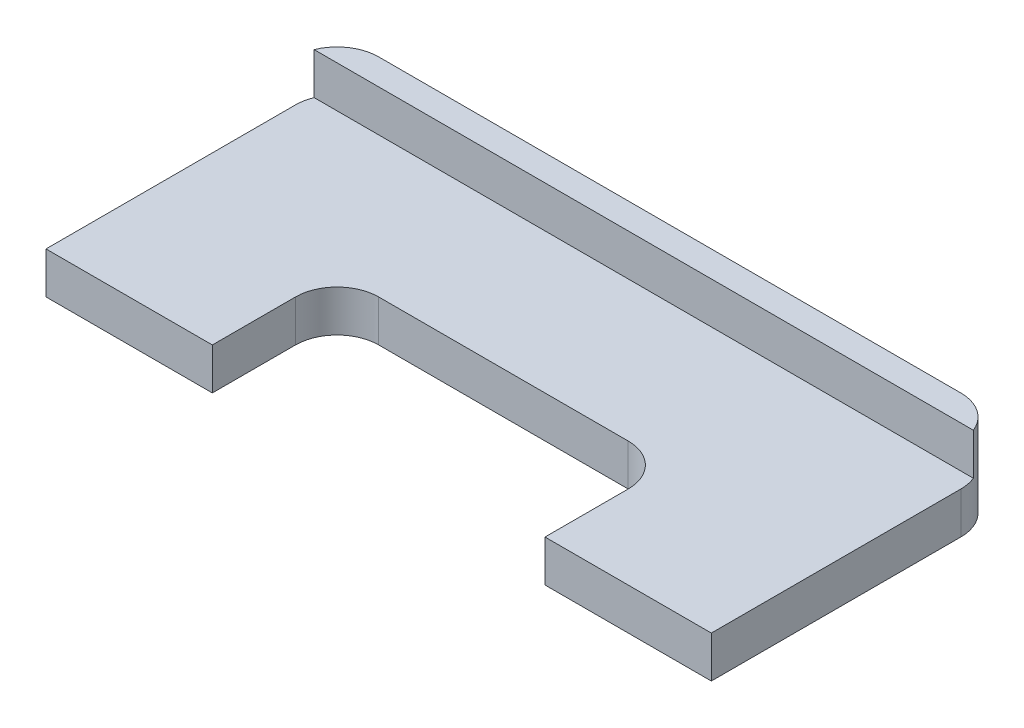
ISO-10303-21;
HEADER;
FILE_DESCRIPTION(('STEP AP214'),'2;1');
FILE_NAME('part.step','',(''),(''),'','','');
FILE_SCHEMA(('AUTOMOTIVE_DESIGN { 1 0 10303 214 1 1 1 1 }'));
ENDSEC;
DATA;
#1=APPLICATION_CONTEXT('core data for automotive mechanical design processes');
#2=APPLICATION_PROTOCOL_DEFINITION('international standard','automotive_design',2000,#1);
#3=PRODUCT_CONTEXT('',#1,'mechanical');
#4=PRODUCT('Part','Part','',(#3));
#5=PRODUCT_RELATED_PRODUCT_CATEGORY('part','',(#4));
#6=PRODUCT_DEFINITION_FORMATION('','',#4);
#7=PRODUCT_DEFINITION_CONTEXT('part definition',#1,'design');
#8=PRODUCT_DEFINITION('design','',#6,#7);
#9=PRODUCT_DEFINITION_SHAPE('','',#8);
#10=(LENGTH_UNIT() NAMED_UNIT(*) SI_UNIT(.MILLI.,.METRE.));
#11=(NAMED_UNIT(*) PLANE_ANGLE_UNIT() SI_UNIT($,.RADIAN.));
#12=(NAMED_UNIT(*) SI_UNIT($,.STERADIAN.) SOLID_ANGLE_UNIT());
#13=UNCERTAINTY_MEASURE_WITH_UNIT(LENGTH_MEASURE(1.E-05),#10,'distance_accuracy_value','');
#14=(GEOMETRIC_REPRESENTATION_CONTEXT(3) GLOBAL_UNCERTAINTY_ASSIGNED_CONTEXT((#13)) GLOBAL_UNIT_ASSIGNED_CONTEXT((#10,
#11,#12)) REPRESENTATION_CONTEXT('',''));
#15=CARTESIAN_POINT('',(0.,0.,0.));
#16=DIRECTION('',(0.,0.,1.));
#17=DIRECTION('',(1.,0.,0.));
#18=AXIS2_PLACEMENT_3D('',#15,#16,#17);
#19=CARTESIAN_POINT('',(0.,1.27,0.));
#20=DIRECTION('',(0.,-1.,0.));
#21=DIRECTION('',(0.,0.,-1.));
#22=AXIS2_PLACEMENT_3D('',#19,#20,#21);
#23=PLANE('',#22);
#24=DIRECTION('',(0.,0.,-1.));
#25=VECTOR('',#24,1.);
#26=CARTESIAN_POINT('',(10.16,1.27,5.08));
#27=LINE('',#26,#25);
#28=CARTESIAN_POINT('',(10.16,1.27,3.81));
#29=VERTEX_POINT('',#28);
#30=CARTESIAN_POINT('',(10.16,1.27,-3.81));
#31=VERTEX_POINT('',#30);
#32=EDGE_CURVE('E150',#29,#31,#27,.T.);
#33=ORIENTED_EDGE('',*,*,#32,.T.);
#34=CARTESIAN_POINT('',(8.89,1.27,-3.81));
#35=DIRECTION('',(0.,-1.,0.));
#36=DIRECTION('',(0.,0.,-1.));
#37=AXIS2_PLACEMENT_3D('',#34,#35,#36);
#38=CIRCLE('',#37,1.27);
#39=CARTESIAN_POINT('',(10.0673215098264,1.27,-4.28625));
#40=VERTEX_POINT('',#39);
#41=EDGE_CURVE('E186',#31,#40,#38,.F.);
#42=ORIENTED_EDGE('',*,*,#41,.T.);
#43=DIRECTION('',(1.,0.,0.));
#44=VECTOR('',#43,1.);
#45=CARTESIAN_POINT('',(-10.16,1.27,-4.28625));
#46=LINE('',#45,#44);
#47=CARTESIAN_POINT('',(-10.0673215098264,1.27,-4.28625));
#48=VERTEX_POINT('',#47);
#49=EDGE_CURVE('E242',#48,#40,#46,.T.);
#50=ORIENTED_EDGE('',*,*,#49,.F.);
#51=CARTESIAN_POINT('',(-8.89,1.27,-3.81));
#52=DIRECTION('',(0.,-1.,0.));
#53=DIRECTION('',(0.,0.,-1.));
#54=AXIS2_PLACEMENT_3D('',#51,#52,#53);
#55=CIRCLE('',#54,1.27);
#56=CARTESIAN_POINT('',(-10.16,1.27,-3.81));
#57=VERTEX_POINT('',#56);
#58=EDGE_CURVE('E184',#48,#57,#55,.F.);
#59=ORIENTED_EDGE('',*,*,#58,.T.);
#60=DIRECTION('',(0.,0.,1.));
#61=VECTOR('',#60,1.);
#62=CARTESIAN_POINT('',(-10.16,1.27,5.08));
#63=LINE('',#62,#61);
#64=CARTESIAN_POINT('',(-10.16,1.27,3.81));
#65=VERTEX_POINT('',#64);
#66=EDGE_CURVE('E159',#57,#65,#63,.T.);
#67=ORIENTED_EDGE('',*,*,#66,.T.);
#68=DIRECTION('',(-1.,0.,0.));
#69=VECTOR('',#68,1.);
#70=CARTESIAN_POINT('',(-5.08,1.27,3.81));
#71=LINE('',#70,#69);
#72=CARTESIAN_POINT('',(-5.08,1.27,3.81));
#73=VERTEX_POINT('',#72);
#74=EDGE_CURVE('E145',#73,#65,#71,.T.);
#75=ORIENTED_EDGE('',*,*,#74,.F.);
#76=DIRECTION('',(0.,0.,1.));
#77=VECTOR('',#76,1.);
#78=CARTESIAN_POINT('',(-5.08,1.27,5.08));
#79=LINE('',#78,#77);
#80=CARTESIAN_POINT('',(-5.08,1.27,1.27));
#81=VERTEX_POINT('',#80);
#82=EDGE_CURVE('E214',#81,#73,#79,.T.);
#83=ORIENTED_EDGE('',*,*,#82,.F.);
#84=CARTESIAN_POINT('',(-3.81,1.27,1.27));
#85=DIRECTION('',(0.,-1.,0.));
#86=DIRECTION('',(0.,0.,-1.));
#87=AXIS2_PLACEMENT_3D('',#84,#85,#86);
#88=CIRCLE('',#87,1.27);
#89=CARTESIAN_POINT('',(-3.81,1.27,0.));
#90=VERTEX_POINT('',#89);
#91=EDGE_CURVE('E41',#81,#90,#88,.T.);
#92=ORIENTED_EDGE('',*,*,#91,.T.);
#93=DIRECTION('',(-1.,0.,0.));
#94=VECTOR('',#93,1.);
#95=CARTESIAN_POINT('',(-5.08,1.27,0.));
#96=LINE('',#95,#94);
#97=CARTESIAN_POINT('',(3.81,1.27,0.));
#98=VERTEX_POINT('',#97);
#99=EDGE_CURVE('E167',#98,#90,#96,.T.);
#100=ORIENTED_EDGE('',*,*,#99,.F.);
#101=CARTESIAN_POINT('',(3.81,1.27,1.27));
#102=DIRECTION('',(0.,-1.,0.));
#103=DIRECTION('',(0.,0.,-1.));
#104=AXIS2_PLACEMENT_3D('',#101,#102,#103);
#105=CIRCLE('',#104,1.27);
#106=CARTESIAN_POINT('',(5.08,1.27,1.27));
#107=VERTEX_POINT('',#106);
#108=EDGE_CURVE('E207',#98,#107,#105,.T.);
#109=ORIENTED_EDGE('',*,*,#108,.T.);
#110=DIRECTION('',(0.,0.,-1.));
#111=VECTOR('',#110,1.);
#112=CARTESIAN_POINT('',(5.08,1.27,5.08));
#113=LINE('',#112,#111);
#114=CARTESIAN_POINT('',(5.08,1.27,3.81));
#115=VERTEX_POINT('',#114);
#116=EDGE_CURVE('E153',#115,#107,#113,.T.);
#117=ORIENTED_EDGE('',*,*,#116,.F.);
#118=DIRECTION('',(-1.,0.,0.));
#119=VECTOR('',#118,1.);
#120=CARTESIAN_POINT('',(10.16,1.27,3.81));
#121=LINE('',#120,#119);
#122=EDGE_CURVE('E137',#29,#115,#121,.T.);
#123=ORIENTED_EDGE('',*,*,#122,.F.);
#124=EDGE_LOOP('',(#33,#42,#50,#59,#67,#75,#83,#92,#100,#109,#117,#123));
#125=FACE_BOUND('',#124,.T.);
#126=ADVANCED_FACE('F33',(#125),#23,.F.);
#127=CARTESIAN_POINT('',(10.16,1.27,5.08));
#128=DIRECTION('',(-1.,0.,0.));
#129=DIRECTION('',(0.,0.,1.));
#130=AXIS2_PLACEMENT_3D('',#127,#128,#129);
#131=PLANE('',#130);
#132=DIRECTION('',(0.,0.,-1.));
#133=VECTOR('',#132,1.);
#134=CARTESIAN_POINT('',(10.16,0.,5.08));
#135=LINE('',#134,#133);
#136=CARTESIAN_POINT('',(10.16,0.,3.81));
#137=VERTEX_POINT('',#136);
#138=CARTESIAN_POINT('',(10.16,0.,-3.81));
#139=VERTEX_POINT('',#138);
#140=EDGE_CURVE('E170',#137,#139,#135,.T.);
#141=ORIENTED_EDGE('',*,*,#140,.T.);
#142=DIRECTION('',(0.,-1.,0.));
#143=VECTOR('',#142,1.);
#144=CARTESIAN_POINT('',(10.16,1.27,-3.81));
#145=LINE('',#144,#143);
#146=EDGE_CURVE('E158',#139,#31,#145,.F.);
#147=ORIENTED_EDGE('',*,*,#146,.T.);
#148=ORIENTED_EDGE('',*,*,#32,.F.);
#149=DIRECTION('',(0.,1.,0.));
#150=VECTOR('',#149,1.);
#151=CARTESIAN_POINT('',(10.16,0.,3.81));
#152=LINE('',#151,#150);
#153=EDGE_CURVE('E134',#137,#29,#152,.T.);
#154=ORIENTED_EDGE('',*,*,#153,.F.);
#155=EDGE_LOOP('',(#141,#147,#148,#154));
#156=FACE_BOUND('',#155,.T.);
#157=ADVANCED_FACE('F156',(#156),#131,.F.);
#158=CARTESIAN_POINT('',(-10.16,1.27,5.08));
#159=DIRECTION('',(1.,0.,0.));
#160=DIRECTION('',(0.,0.,-1.));
#161=AXIS2_PLACEMENT_3D('',#158,#159,#160);
#162=PLANE('',#161);
#163=ORIENTED_EDGE('',*,*,#66,.F.);
#164=DIRECTION('',(0.,-1.,0.));
#165=VECTOR('',#164,1.);
#166=CARTESIAN_POINT('',(-10.16,1.27,-3.81));
#167=LINE('',#166,#165);
#168=CARTESIAN_POINT('',(-10.16,0.,-3.81));
#169=VERTEX_POINT('',#168);
#170=EDGE_CURVE('E204',#57,#169,#167,.T.);
#171=ORIENTED_EDGE('',*,*,#170,.T.);
#172=DIRECTION('',(0.,0.,1.));
#173=VECTOR('',#172,1.);
#174=CARTESIAN_POINT('',(-10.16,0.,5.08));
#175=LINE('',#174,#173);
#176=CARTESIAN_POINT('',(-10.16,0.,3.81));
#177=VERTEX_POINT('',#176);
#178=EDGE_CURVE('E160',#169,#177,#175,.T.);
#179=ORIENTED_EDGE('',*,*,#178,.T.);
#180=DIRECTION('',(0.,-1.,0.));
#181=VECTOR('',#180,1.);
#182=CARTESIAN_POINT('',(-10.16,1.27,3.81));
#183=LINE('',#182,#181);
#184=EDGE_CURVE('E258',#65,#177,#183,.T.);
#185=ORIENTED_EDGE('',*,*,#184,.F.);
#186=EDGE_LOOP('',(#163,#171,#179,#185));
#187=FACE_BOUND('',#186,.T.);
#188=ADVANCED_FACE('F284',(#187),#162,.F.);
#189=CARTESIAN_POINT('',(0.,0.,0.));
#190=DIRECTION('',(0.,-1.,0.));
#191=DIRECTION('',(0.,0.,-1.));
#192=AXIS2_PLACEMENT_3D('',#189,#190,#191);
#193=PLANE('',#192);
#194=DIRECTION('',(-1.,0.,0.));
#195=VECTOR('',#194,1.);
#196=CARTESIAN_POINT('',(-10.16,0.,-5.08));
#197=LINE('',#196,#195);
#198=CARTESIAN_POINT('',(8.89,0.,-5.08));
#199=VERTEX_POINT('',#198);
#200=CARTESIAN_POINT('',(-8.89,0.,-5.08));
#201=VERTEX_POINT('',#200);
#202=EDGE_CURVE('E164',#199,#201,#197,.T.);
#203=ORIENTED_EDGE('',*,*,#202,.F.);
#204=CARTESIAN_POINT('',(8.89,0.,-3.81));
#205=DIRECTION('',(0.,-1.,0.));
#206=DIRECTION('',(0.,0.,-1.));
#207=AXIS2_PLACEMENT_3D('',#204,#205,#206);
#208=CIRCLE('',#207,1.27);
#209=EDGE_CURVE('E181',#199,#139,#208,.T.);
#210=ORIENTED_EDGE('',*,*,#209,.T.);
#211=ORIENTED_EDGE('',*,*,#140,.F.);
#212=DIRECTION('',(1.,0.,0.));
#213=VECTOR('',#212,1.);
#214=CARTESIAN_POINT('',(5.08,0.,3.81));
#215=LINE('',#214,#213);
#216=CARTESIAN_POINT('',(5.08,0.,3.81));
#217=VERTEX_POINT('',#216);
#218=EDGE_CURVE('E140',#217,#137,#215,.T.);
#219=ORIENTED_EDGE('',*,*,#218,.F.);
#220=DIRECTION('',(0.,0.,-1.));
#221=VECTOR('',#220,1.);
#222=CARTESIAN_POINT('',(5.08,0.,5.08));
#223=LINE('',#222,#221);
#224=CARTESIAN_POINT('',(5.08,0.,1.27));
#225=VERTEX_POINT('',#224);
#226=EDGE_CURVE('E237',#217,#225,#223,.T.);
#227=ORIENTED_EDGE('',*,*,#226,.T.);
#228=CARTESIAN_POINT('',(3.81,0.,1.27));
#229=DIRECTION('',(0.,-1.,0.));
#230=DIRECTION('',(0.,0.,-1.));
#231=AXIS2_PLACEMENT_3D('',#228,#229,#230);
#232=CIRCLE('',#231,1.27);
#233=CARTESIAN_POINT('',(3.81,0.,0.));
#234=VERTEX_POINT('',#233);
#235=EDGE_CURVE('E209',#225,#234,#232,.F.);
#236=ORIENTED_EDGE('',*,*,#235,.T.);
#237=DIRECTION('',(-1.,0.,0.));
#238=VECTOR('',#237,1.);
#239=CARTESIAN_POINT('',(-5.08,0.,0.));
#240=LINE('',#239,#238);
#241=CARTESIAN_POINT('',(-3.81,0.,0.));
#242=VERTEX_POINT('',#241);
#243=EDGE_CURVE('E172',#234,#242,#240,.T.);
#244=ORIENTED_EDGE('',*,*,#243,.T.);
#245=CARTESIAN_POINT('',(-3.81,0.,1.27));
#246=DIRECTION('',(0.,-1.,0.));
#247=DIRECTION('',(0.,0.,-1.));
#248=AXIS2_PLACEMENT_3D('',#245,#246,#247);
#249=CIRCLE('',#248,1.27);
#250=CARTESIAN_POINT('',(-5.08,0.,1.27));
#251=VERTEX_POINT('',#250);
#252=EDGE_CURVE('E11',#242,#251,#249,.F.);
#253=ORIENTED_EDGE('',*,*,#252,.T.);
#254=DIRECTION('',(0.,0.,1.));
#255=VECTOR('',#254,1.);
#256=CARTESIAN_POINT('',(-5.08,0.,5.08));
#257=LINE('',#256,#255);
#258=CARTESIAN_POINT('',(-5.08,0.,3.81));
#259=VERTEX_POINT('',#258);
#260=EDGE_CURVE('E223',#251,#259,#257,.T.);
#261=ORIENTED_EDGE('',*,*,#260,.T.);
#262=DIRECTION('',(1.,0.,0.));
#263=VECTOR('',#262,1.);
#264=CARTESIAN_POINT('',(-10.16,0.,3.81));
#265=LINE('',#264,#263);
#266=EDGE_CURVE('E261',#177,#259,#265,.T.);
#267=ORIENTED_EDGE('',*,*,#266,.F.);
#268=ORIENTED_EDGE('',*,*,#178,.F.);
#269=CARTESIAN_POINT('',(-8.89,0.,-3.81));
#270=DIRECTION('',(0.,-1.,0.));
#271=DIRECTION('',(0.,0.,-1.));
#272=AXIS2_PLACEMENT_3D('',#269,#270,#271);
#273=CIRCLE('',#272,1.27);
#274=EDGE_CURVE('E179',#169,#201,#273,.T.);
#275=ORIENTED_EDGE('',*,*,#274,.T.);
#276=EDGE_LOOP('',(#203,#210,#211,#219,#227,#236,#244,#253,#261,#267,#268,#275));
#277=FACE_BOUND('',#276,.T.);
#278=ADVANCED_FACE('F229',(#277),#193,.T.);
#279=CARTESIAN_POINT('',(-5.08,0.,5.08));
#280=DIRECTION('',(-1.,0.,0.));
#281=DIRECTION('',(0.,0.,1.));
#282=AXIS2_PLACEMENT_3D('',#279,#280,#281);
#283=PLANE('',#282);
#284=ORIENTED_EDGE('',*,*,#260,.F.);
#285=DIRECTION('',(0.,1.,0.));
#286=VECTOR('',#285,1.);
#287=CARTESIAN_POINT('',(-5.08,1.27,1.27));
#288=LINE('',#287,#286);
#289=EDGE_CURVE('E201',#251,#81,#288,.T.);
#290=ORIENTED_EDGE('',*,*,#289,.T.);
#291=ORIENTED_EDGE('',*,*,#82,.T.);
#292=DIRECTION('',(0.,1.,0.));
#293=VECTOR('',#292,1.);
#294=CARTESIAN_POINT('',(-5.08,0.,3.81));
#295=LINE('',#294,#293);
#296=EDGE_CURVE('E236',#259,#73,#295,.T.);
#297=ORIENTED_EDGE('',*,*,#296,.F.);
#298=EDGE_LOOP('',(#284,#290,#291,#297));
#299=FACE_BOUND('',#298,.T.);
#300=ADVANCED_FACE('F234',(#299),#283,.F.);
#301=CARTESIAN_POINT('',(5.08,0.,5.08));
#302=DIRECTION('',(1.,0.,0.));
#303=DIRECTION('',(0.,0.,-1.));
#304=AXIS2_PLACEMENT_3D('',#301,#302,#303);
#305=PLANE('',#304);
#306=ORIENTED_EDGE('',*,*,#116,.T.);
#307=DIRECTION('',(0.,1.,0.));
#308=VECTOR('',#307,1.);
#309=CARTESIAN_POINT('',(5.08,0.,1.27));
#310=LINE('',#309,#308);
#311=EDGE_CURVE('E199',#107,#225,#310,.F.);
#312=ORIENTED_EDGE('',*,*,#311,.T.);
#313=ORIENTED_EDGE('',*,*,#226,.F.);
#314=DIRECTION('',(0.,-1.,0.));
#315=VECTOR('',#314,1.);
#316=CARTESIAN_POINT('',(5.08,1.27,3.81));
#317=LINE('',#316,#315);
#318=EDGE_CURVE('E154',#115,#217,#317,.T.);
#319=ORIENTED_EDGE('',*,*,#318,.F.);
#320=EDGE_LOOP('',(#306,#312,#313,#319));
#321=FACE_BOUND('',#320,.T.);
#322=ADVANCED_FACE('F249',(#321),#305,.F.);
#323=CARTESIAN_POINT('',(-10.16,1.27,-5.08));
#324=DIRECTION('',(0.,0.,1.));
#325=DIRECTION('',(1.,0.,0.));
#326=AXIS2_PLACEMENT_3D('',#323,#324,#325);
#327=PLANE('',#326);
#328=DIRECTION('',(-1.,0.,0.));
#329=VECTOR('',#328,1.);
#330=CARTESIAN_POINT('',(-10.16,2.54,-5.08));
#331=LINE('',#330,#329);
#332=CARTESIAN_POINT('',(8.89,2.54,-5.08));
#333=VERTEX_POINT('',#332);
#334=CARTESIAN_POINT('',(-8.89,2.54,-5.08));
#335=VERTEX_POINT('',#334);
#336=EDGE_CURVE('E246',#333,#335,#331,.T.);
#337=ORIENTED_EDGE('',*,*,#336,.F.);
#338=DIRECTION('',(0.,-1.,0.));
#339=VECTOR('',#338,1.);
#340=CARTESIAN_POINT('',(8.89,1.27,-5.08));
#341=LINE('',#340,#339);
#342=EDGE_CURVE('E176',#333,#199,#341,.T.);
#343=ORIENTED_EDGE('',*,*,#342,.T.);
#344=ORIENTED_EDGE('',*,*,#202,.T.);
#345=DIRECTION('',(0.,-1.,0.));
#346=VECTOR('',#345,1.);
#347=CARTESIAN_POINT('',(-8.89,1.27,-5.08));
#348=LINE('',#347,#346);
#349=EDGE_CURVE('E162',#201,#335,#348,.F.);
#350=ORIENTED_EDGE('',*,*,#349,.T.);
#351=EDGE_LOOP('',(#337,#343,#344,#350));
#352=FACE_BOUND('',#351,.T.);
#353=ADVANCED_FACE('F281',(#352),#327,.F.);
#354=CARTESIAN_POINT('',(-5.08,0.,0.));
#355=DIRECTION('',(0.,0.,-1.));
#356=DIRECTION('',(-1.,0.,0.));
#357=AXIS2_PLACEMENT_3D('',#354,#355,#356);
#358=PLANE('',#357);
#359=ORIENTED_EDGE('',*,*,#243,.F.);
#360=DIRECTION('',(0.,1.,0.));
#361=VECTOR('',#360,1.);
#362=CARTESIAN_POINT('',(3.81,1.27,0.));
#363=LINE('',#362,#361);
#364=EDGE_CURVE('E196',#234,#98,#363,.T.);
#365=ORIENTED_EDGE('',*,*,#364,.T.);
#366=ORIENTED_EDGE('',*,*,#99,.T.);
#367=DIRECTION('',(0.,1.,0.));
#368=VECTOR('',#367,1.);
#369=CARTESIAN_POINT('',(-3.81,0.,0.));
#370=LINE('',#369,#368);
#371=EDGE_CURVE('E194',#90,#242,#370,.F.);
#372=ORIENTED_EDGE('',*,*,#371,.T.);
#373=EDGE_LOOP('',(#359,#365,#366,#372));
#374=FACE_BOUND('',#373,.T.);
#375=ADVANCED_FACE('F220',(#374),#358,.F.);
#376=CARTESIAN_POINT('',(-10.16,2.54,-4.28625));
#377=DIRECTION('',(0.,0.,-1.));
#378=DIRECTION('',(-1.,0.,0.));
#379=AXIS2_PLACEMENT_3D('',#376,#377,#378);
#380=PLANE('',#379);
#381=ORIENTED_EDGE('',*,*,#49,.T.);
#382=DIRECTION('',(0.,-1.,0.));
#383=VECTOR('',#382,1.);
#384=CARTESIAN_POINT('',(10.0673215098264,1.27,-4.28625));
#385=LINE('',#384,#383);
#386=CARTESIAN_POINT('',(10.0673215098264,2.54,-4.28625));
#387=VERTEX_POINT('',#386);
#388=EDGE_CURVE('E48',#40,#387,#385,.F.);
#389=ORIENTED_EDGE('',*,*,#388,.T.);
#390=DIRECTION('',(1.,0.,0.));
#391=VECTOR('',#390,1.);
#392=CARTESIAN_POINT('',(-10.16,2.54,-4.28625));
#393=LINE('',#392,#391);
#394=CARTESIAN_POINT('',(-10.0673215098264,2.54,-4.28625));
#395=VERTEX_POINT('',#394);
#396=EDGE_CURVE('E255',#395,#387,#393,.T.);
#397=ORIENTED_EDGE('',*,*,#396,.F.);
#398=DIRECTION('',(0.,-1.,0.));
#399=VECTOR('',#398,1.);
#400=CARTESIAN_POINT('',(-10.0673215098264,2.54,-4.28625));
#401=LINE('',#400,#399);
#402=EDGE_CURVE('E188',#395,#48,#401,.T.);
#403=ORIENTED_EDGE('',*,*,#402,.T.);
#404=EDGE_LOOP('',(#381,#389,#397,#403));
#405=FACE_BOUND('',#404,.T.);
#406=ADVANCED_FACE('F277',(#405),#380,.F.);
#407=CARTESIAN_POINT('',(0.,2.54,0.));
#408=DIRECTION('',(0.,1.,0.));
#409=DIRECTION('',(0.,0.,1.));
#410=AXIS2_PLACEMENT_3D('',#407,#408,#409);
#411=PLANE('',#410);
#412=ORIENTED_EDGE('',*,*,#396,.T.);
#413=CARTESIAN_POINT('',(8.89,2.54,-3.81));
#414=DIRECTION('',(0.,1.,0.));
#415=DIRECTION('',(0.,0.,1.));
#416=AXIS2_PLACEMENT_3D('',#413,#414,#415);
#417=CIRCLE('',#416,1.27);
#418=EDGE_CURVE('E192',#387,#333,#417,.T.);
#419=ORIENTED_EDGE('',*,*,#418,.T.);
#420=ORIENTED_EDGE('',*,*,#336,.T.);
#421=CARTESIAN_POINT('',(-8.89,2.54,-3.81));
#422=DIRECTION('',(0.,1.,0.));
#423=DIRECTION('',(0.,0.,1.));
#424=AXIS2_PLACEMENT_3D('',#421,#422,#423);
#425=CIRCLE('',#424,1.27);
#426=EDGE_CURVE('E55',#335,#395,#425,.T.);
#427=ORIENTED_EDGE('',*,*,#426,.T.);
#428=EDGE_LOOP('',(#412,#419,#420,#427));
#429=FACE_BOUND('',#428,.T.);
#430=ADVANCED_FACE('F267',(#429),#411,.T.);
#431=CARTESIAN_POINT('',(0.,0.,3.81));
#432=DIRECTION('',(0.,0.,1.));
#433=DIRECTION('',(1.,0.,0.));
#434=AXIS2_PLACEMENT_3D('',#431,#432,#433);
#435=PLANE('',#434);
#436=ORIENTED_EDGE('',*,*,#153,.T.);
#437=ORIENTED_EDGE('',*,*,#122,.T.);
#438=ORIENTED_EDGE('',*,*,#318,.T.);
#439=ORIENTED_EDGE('',*,*,#218,.T.);
#440=EDGE_LOOP('',(#436,#437,#438,#439));
#441=FACE_BOUND('',#440,.T.);
#442=ADVANCED_FACE('F136',(#441),#435,.T.);
#443=CARTESIAN_POINT('',(0.,0.,3.81));
#444=DIRECTION('',(0.,0.,1.));
#445=DIRECTION('',(1.,0.,0.));
#446=AXIS2_PLACEMENT_3D('',#443,#444,#445);
#447=PLANE('',#446);
#448=ORIENTED_EDGE('',*,*,#184,.T.);
#449=ORIENTED_EDGE('',*,*,#266,.T.);
#450=ORIENTED_EDGE('',*,*,#296,.T.);
#451=ORIENTED_EDGE('',*,*,#74,.T.);
#452=EDGE_LOOP('',(#448,#449,#450,#451));
#453=FACE_BOUND('',#452,.T.);
#454=ADVANCED_FACE('F287',(#453),#447,.T.);
#455=CARTESIAN_POINT('',(8.89,1.27,-3.81));
#456=DIRECTION('',(0.,-1.,0.));
#457=DIRECTION('',(0.,0.,-1.));
#458=AXIS2_PLACEMENT_3D('',#455,#456,#457);
#459=CYLINDRICAL_SURFACE('',#458,1.27);
#460=ORIENTED_EDGE('',*,*,#41,.F.);
#461=ORIENTED_EDGE('',*,*,#146,.F.);
#462=ORIENTED_EDGE('',*,*,#209,.F.);
#463=ORIENTED_EDGE('',*,*,#342,.F.);
#464=ORIENTED_EDGE('',*,*,#418,.F.);
#465=ORIENTED_EDGE('',*,*,#388,.F.);
#466=EDGE_LOOP('',(#460,#461,#462,#463,#464,#465));
#467=FACE_BOUND('',#466,.T.);
#468=ADVANCED_FACE('F280',(#467),#459,.T.);
#469=CARTESIAN_POINT('',(3.81,0.,1.27));
#470=DIRECTION('',(0.,-1.,0.));
#471=DIRECTION('',(0.,0.,-1.));
#472=AXIS2_PLACEMENT_3D('',#469,#470,#471);
#473=CYLINDRICAL_SURFACE('',#472,1.27);
#474=ORIENTED_EDGE('',*,*,#235,.F.);
#475=ORIENTED_EDGE('',*,*,#311,.F.);
#476=ORIENTED_EDGE('',*,*,#108,.F.);
#477=ORIENTED_EDGE('',*,*,#364,.F.);
#478=EDGE_LOOP('',(#474,#475,#476,#477));
#479=FACE_BOUND('',#478,.T.);
#480=ADVANCED_FACE('F253',(#479),#473,.F.);
#481=CARTESIAN_POINT('',(-3.81,0.,1.27));
#482=DIRECTION('',(0.,-1.,0.));
#483=DIRECTION('',(0.,0.,-1.));
#484=AXIS2_PLACEMENT_3D('',#481,#482,#483);
#485=CYLINDRICAL_SURFACE('',#484,1.27);
#486=ORIENTED_EDGE('',*,*,#252,.F.);
#487=ORIENTED_EDGE('',*,*,#371,.F.);
#488=ORIENTED_EDGE('',*,*,#91,.F.);
#489=ORIENTED_EDGE('',*,*,#289,.F.);
#490=EDGE_LOOP('',(#486,#487,#488,#489));
#491=FACE_BOUND('',#490,.T.);
#492=ADVANCED_FACE('F225',(#491),#485,.F.);
#493=CARTESIAN_POINT('',(-8.89,1.27,-3.81));
#494=DIRECTION('',(0.,-1.,0.));
#495=DIRECTION('',(0.,0.,-1.));
#496=AXIS2_PLACEMENT_3D('',#493,#494,#495);
#497=CYLINDRICAL_SURFACE('',#496,1.27);
#498=ORIENTED_EDGE('',*,*,#426,.F.);
#499=ORIENTED_EDGE('',*,*,#349,.F.);
#500=ORIENTED_EDGE('',*,*,#274,.F.);
#501=ORIENTED_EDGE('',*,*,#170,.F.);
#502=ORIENTED_EDGE('',*,*,#58,.F.);
#503=ORIENTED_EDGE('',*,*,#402,.F.);
#504=EDGE_LOOP('',(#498,#499,#500,#501,#502,#503));
#505=FACE_BOUND('',#504,.T.);
#506=ADVANCED_FACE('F35',(#505),#497,.T.);
#507=CLOSED_SHELL('',(#126,#157,#188,#278,#300,#322,#353,#375,#406,#430,#442,#454,#468,#480,
#492,#506));
#508=MANIFOLD_SOLID_BREP('B2',#507);
#509=ADVANCED_BREP_SHAPE_REPRESENTATION('',(#18,#508),#14);
#510=SHAPE_DEFINITION_REPRESENTATION(#9,#509);
ENDSEC;
END-ISO-10303-21;
